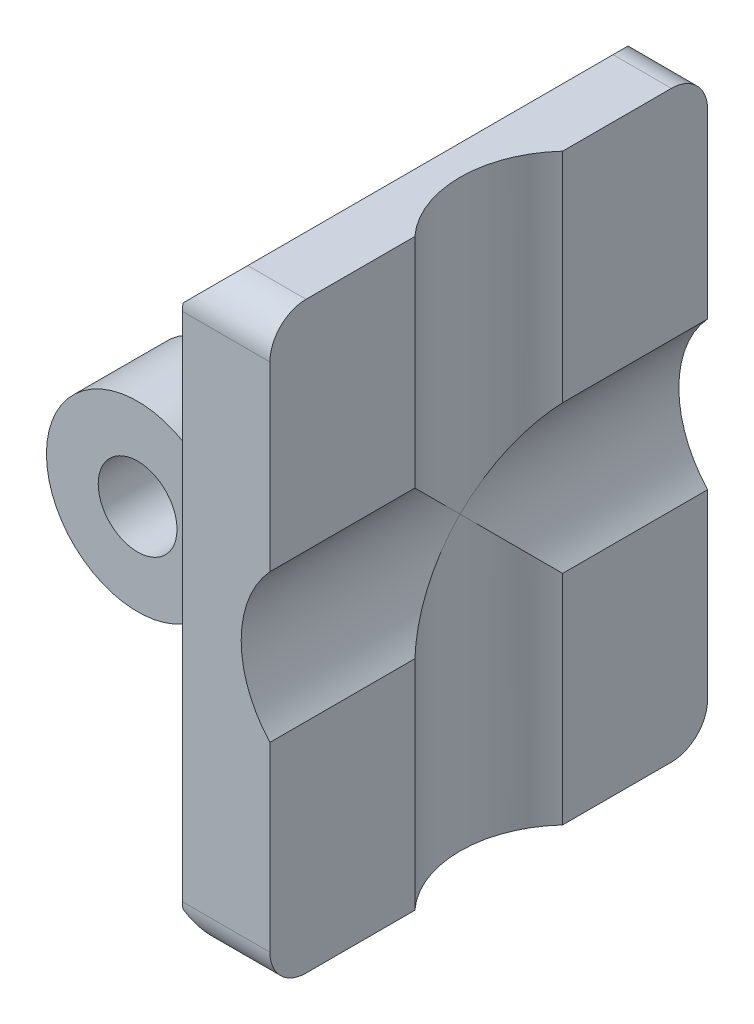
ISO-10303-21;
HEADER;
FILE_DESCRIPTION(('STEP AP214'),'2;1');
FILE_NAME('part.step','',(''),(''),'','','');
FILE_SCHEMA(('AUTOMOTIVE_DESIGN { 1 0 10303 214 1 1 1 1 }'));
ENDSEC;
DATA;
#1=APPLICATION_CONTEXT('core data for automotive mechanical design processes');
#2=APPLICATION_PROTOCOL_DEFINITION('international standard','automotive_design',2000,#1);
#3=PRODUCT_CONTEXT('',#1,'mechanical');
#4=PRODUCT('Part','Part','',(#3));
#5=PRODUCT_RELATED_PRODUCT_CATEGORY('part','',(#4));
#6=PRODUCT_DEFINITION_FORMATION('','',#4);
#7=PRODUCT_DEFINITION_CONTEXT('part definition',#1,'design');
#8=PRODUCT_DEFINITION('design','',#6,#7);
#9=PRODUCT_DEFINITION_SHAPE('','',#8);
#10=(LENGTH_UNIT() NAMED_UNIT(*) SI_UNIT(.MILLI.,.METRE.));
#11=(NAMED_UNIT(*) PLANE_ANGLE_UNIT() SI_UNIT($,.RADIAN.));
#12=(NAMED_UNIT(*) SI_UNIT($,.STERADIAN.) SOLID_ANGLE_UNIT());
#13=UNCERTAINTY_MEASURE_WITH_UNIT(LENGTH_MEASURE(1.E-05),#10,'distance_accuracy_value','');
#14=(GEOMETRIC_REPRESENTATION_CONTEXT(3) GLOBAL_UNCERTAINTY_ASSIGNED_CONTEXT((#13)) GLOBAL_UNIT_ASSIGNED_CONTEXT((#10,
#11,#12)) REPRESENTATION_CONTEXT('',''));
#15=CARTESIAN_POINT('',(0.,0.,0.));
#16=DIRECTION('',(0.,0.,1.));
#17=DIRECTION('',(1.,0.,0.));
#18=AXIS2_PLACEMENT_3D('',#15,#16,#17);
#19=CARTESIAN_POINT('',(0.,0.,-6.731));
#20=DIRECTION('',(0.,0.,1.));
#21=DIRECTION('',(1.,0.,0.));
#22=AXIS2_PLACEMENT_3D('',#19,#20,#21);
#23=CYLINDRICAL_SURFACE('',#22,3.96875);
#24=DIRECTION('',(0.,0.,1.));
#25=VECTOR('',#24,1.);
#26=CARTESIAN_POINT('',(2.38125,3.175,-6.731));
#27=LINE('',#26,#25);
#28=CARTESIAN_POINT('',(2.38125,3.175,-6.731));
#29=VERTEX_POINT('',#28);
#30=CARTESIAN_POINT('',(2.38125,3.175,6.731));
#31=VERTEX_POINT('',#30);
#32=EDGE_CURVE('E385',#29,#31,#27,.T.);
#33=ORIENTED_EDGE('',*,*,#32,.F.);
#34=CARTESIAN_POINT('',(0.,0.,-6.731));
#35=DIRECTION('',(0.,0.,-1.));
#36=DIRECTION('',(-1.,0.,0.));
#37=AXIS2_PLACEMENT_3D('',#34,#35,#36);
#38=CIRCLE('',#37,3.96875);
#39=CARTESIAN_POINT('',(2.38125,-3.175,-6.731));
#40=VERTEX_POINT('',#39);
#41=EDGE_CURVE('E254',#40,#29,#38,.T.);
#42=ORIENTED_EDGE('',*,*,#41,.F.);
#43=DIRECTION('',(0.,0.,1.));
#44=VECTOR('',#43,1.);
#45=CARTESIAN_POINT('',(2.38125,-3.175,-6.731));
#46=LINE('',#45,#44);
#47=CARTESIAN_POINT('',(2.38125,-3.175,6.731));
#48=VERTEX_POINT('',#47);
#49=EDGE_CURVE('E321',#40,#48,#46,.T.);
#50=ORIENTED_EDGE('',*,*,#49,.T.);
#51=CARTESIAN_POINT('',(0.,0.,6.731));
#52=DIRECTION('',(0.,0.,1.));
#53=DIRECTION('',(1.,0.,0.));
#54=AXIS2_PLACEMENT_3D('',#51,#52,#53);
#55=CIRCLE('',#54,3.96875);
#56=EDGE_CURVE('E263',#31,#48,#55,.T.);
#57=ORIENTED_EDGE('',*,*,#56,.F.);
#58=EDGE_LOOP('',(#33,#42,#50,#57));
#59=FACE_BOUND('',#58,.T.);
#60=DIRECTION('',(0.,0.,-1.));
#61=VECTOR('',#60,1.);
#62=CARTESIAN_POINT('',(-0.212777019498933,3.96304207679822,2.667));
#63=LINE('',#62,#61);
#64=CARTESIAN_POINT('',(-0.212777019498933,3.96304207679822,2.667));
#65=VERTEX_POINT('',#64);
#66=CARTESIAN_POINT('',(-0.212777019498933,3.96304207679822,1.27));
#67=VERTEX_POINT('',#66);
#68=EDGE_CURVE('E230',#65,#67,#63,.T.);
#69=ORIENTED_EDGE('',*,*,#68,.F.);
#70=CARTESIAN_POINT('',(0.,0.,2.667));
#71=DIRECTION('',(0.,0.,-1.));
#72=DIRECTION('',(-1.,0.,0.));
#73=AXIS2_PLACEMENT_3D('',#70,#71,#72);
#74=CIRCLE('',#73,3.96875);
#75=CARTESIAN_POINT('',(-3.96304207679822,0.212777019498943,2.667));
#76=VERTEX_POINT('',#75);
#77=EDGE_CURVE('E217',#76,#65,#74,.T.);
#78=ORIENTED_EDGE('',*,*,#77,.F.);
#79=DIRECTION('',(0.,0.,-1.));
#80=VECTOR('',#79,1.);
#81=CARTESIAN_POINT('',(-3.96304207679822,0.212777019498943,2.667));
#82=LINE('',#81,#80);
#83=CARTESIAN_POINT('',(-3.96304207679822,0.212777019498943,1.27));
#84=VERTEX_POINT('',#83);
#85=EDGE_CURVE('E232',#76,#84,#82,.T.);
#86=ORIENTED_EDGE('',*,*,#85,.T.);
#87=CARTESIAN_POINT('',(0.,0.,1.27));
#88=DIRECTION('',(0.,0.,-1.));
#89=DIRECTION('',(-1.,0.,0.));
#90=AXIS2_PLACEMENT_3D('',#87,#88,#89);
#91=CIRCLE('',#90,3.96875);
#92=EDGE_CURVE('E234',#84,#67,#91,.T.);
#93=ORIENTED_EDGE('',*,*,#92,.T.);
#94=EDGE_LOOP('',(#69,#78,#86,#93));
#95=FACE_BOUND('',#94,.T.);
#96=ADVANCED_FACE('F51',(#59,#95),#23,.T.);
#97=CARTESIAN_POINT('',(2.38125,-3.175,-6.731));
#98=DIRECTION('',(0.,-1.,0.));
#99=DIRECTION('',(0.,0.,-1.));
#100=AXIS2_PLACEMENT_3D('',#97,#98,#99);
#101=PLANE('',#100);
#102=DIRECTION('',(-1.,0.,0.));
#103=VECTOR('',#102,1.);
#104=CARTESIAN_POINT('',(4.74345,-3.175,-6.731));
#105=LINE('',#104,#103);
#106=CARTESIAN_POINT('',(3.47345,-3.175,-6.731));
#107=VERTEX_POINT('',#106);
#108=EDGE_CURVE('E261',#107,#40,#105,.T.);
#109=ORIENTED_EDGE('',*,*,#108,.F.);
#110=DIRECTION('',(0.,0.,-1.));
#111=VECTOR('',#110,1.);
#112=CARTESIAN_POINT('',(3.47345,-3.175,6.731));
#113=LINE('',#112,#111);
#114=CARTESIAN_POINT('',(3.47345,-3.175,6.731));
#115=VERTEX_POINT('',#114);
#116=EDGE_CURVE('E990',#107,#115,#113,.F.);
#117=ORIENTED_EDGE('',*,*,#116,.T.);
#118=DIRECTION('',(1.,0.,0.));
#119=VECTOR('',#118,1.);
#120=CARTESIAN_POINT('',(2.38125,-3.175,6.731));
#121=LINE('',#120,#119);
#122=EDGE_CURVE('E266',#48,#115,#121,.T.);
#123=ORIENTED_EDGE('',*,*,#122,.F.);
#124=ORIENTED_EDGE('',*,*,#49,.F.);
#125=EDGE_LOOP('',(#109,#117,#123,#124));
#126=FACE_BOUND('',#125,.T.);
#127=ADVANCED_FACE('F910',(#126),#101,.T.);
#128=CARTESIAN_POINT('',(2.38125,3.175,-6.731));
#129=DIRECTION('',(0.,1.,0.));
#130=DIRECTION('',(1.,0.,0.));
#131=AXIS2_PLACEMENT_3D('',#128,#129,#130);
#132=PLANE('',#131);
#133=DIRECTION('',(-1.,0.,0.));
#134=VECTOR('',#133,1.);
#135=CARTESIAN_POINT('',(4.74345,3.175,6.731));
#136=LINE('',#135,#134);
#137=CARTESIAN_POINT('',(3.47345,3.175,6.731));
#138=VERTEX_POINT('',#137);
#139=EDGE_CURVE('E271',#138,#31,#136,.T.);
#140=ORIENTED_EDGE('',*,*,#139,.F.);
#141=DIRECTION('',(0.,0.,-1.));
#142=VECTOR('',#141,1.);
#143=CARTESIAN_POINT('',(3.47345,3.175,-6.731));
#144=LINE('',#143,#142);
#145=CARTESIAN_POINT('',(3.47345,3.175,-6.731));
#146=VERTEX_POINT('',#145);
#147=EDGE_CURVE('E987',#138,#146,#144,.T.);
#148=ORIENTED_EDGE('',*,*,#147,.T.);
#149=DIRECTION('',(1.,0.,0.));
#150=VECTOR('',#149,1.);
#151=CARTESIAN_POINT('',(2.38125,3.175,-6.731));
#152=LINE('',#151,#150);
#153=EDGE_CURVE('E256',#29,#146,#152,.T.);
#154=ORIENTED_EDGE('',*,*,#153,.F.);
#155=ORIENTED_EDGE('',*,*,#32,.T.);
#156=EDGE_LOOP('',(#140,#148,#154,#155));
#157=FACE_BOUND('',#156,.T.);
#158=ADVANCED_FACE('F916',(#157),#132,.T.);
#159=CARTESIAN_POINT('',(12.065,-12.7,0.));
#160=DIRECTION('',(0.,1.,0.));
#161=DIRECTION('',(0.,0.,1.));
#162=AXIS2_PLACEMENT_3D('',#159,#160,#161);
#163=CYLINDRICAL_SURFACE('',#162,4.7625);
#164=CARTESIAN_POINT('',(7.3025,0.,0.));
#165=CARTESIAN_POINT('',(7.30249999999999,-1.20523715720365,1.20523715720366));
#166=CARTESIAN_POINT('',(7.7392772362853,-2.32854577506756,2.32854577506756));
#167=CARTESIAN_POINT('',(8.55345,-3.21720730564572,3.21720730564572));
#168=(BOUNDED_CURVE() B_SPLINE_CURVE(3,(#164,#165,#166,#167),.UNSPECIFIED.,.F.,
.F.) B_SPLINE_CURVE_WITH_KNOTS((4,4),(1.5707963267949,2.31247836980469),
.UNSPECIFIED.) CURVE() GEOMETRIC_REPRESENTATION_ITEM() RATIONAL_B_SPLINE_CURVE((1.,
0.954681926374368,0.954681926374368,1.)) REPRESENTATION_ITEM(''));
#169=CARTESIAN_POINT('',(7.3025,0.,0.));
#170=VERTEX_POINT('',#169);
#171=CARTESIAN_POINT('',(8.55345,-3.21720730564572,3.21720730564573));
#172=VERTEX_POINT('',#171);
#173=EDGE_CURVE('E384',#170,#172,#168,.T.);
#174=ORIENTED_EDGE('',*,*,#173,.T.);
#175=DIRECTION('',(0.,1.,0.));
#176=VECTOR('',#175,1.);
#177=CARTESIAN_POINT('',(8.55345,-12.7,3.21720730564573));
#178=LINE('',#177,#176);
#179=CARTESIAN_POINT('',(8.55345,-12.7,3.21720730564573));
#180=VERTEX_POINT('',#179);
#181=EDGE_CURVE('E310',#180,#172,#178,.T.);
#182=ORIENTED_EDGE('',*,*,#181,.F.);
#183=CARTESIAN_POINT('',(12.065,-12.7,0.));
#184=DIRECTION('',(0.,1.,0.));
#185=DIRECTION('',(0.,0.,-1.));
#186=AXIS2_PLACEMENT_3D('',#183,#184,#185);
#187=CIRCLE('',#186,4.76250000000002);
#188=CARTESIAN_POINT('',(8.55345,-12.7,-3.21720730564573));
#189=VERTEX_POINT('',#188);
#190=EDGE_CURVE('E304',#189,#180,#187,.T.);
#191=ORIENTED_EDGE('',*,*,#190,.F.);
#192=DIRECTION('',(0.,1.,0.));
#193=VECTOR('',#192,1.);
#194=CARTESIAN_POINT('',(8.55345,-12.7,-3.21720730564573));
#195=LINE('',#194,#193);
#196=CARTESIAN_POINT('',(8.55345,-3.21720730564569,-3.21720730564573));
#197=VERTEX_POINT('',#196);
#198=EDGE_CURVE('E307',#189,#197,#195,.T.);
#199=ORIENTED_EDGE('',*,*,#198,.T.);
#200=CARTESIAN_POINT('',(8.55345,-3.21720730564572,-3.21720730564572));
#201=CARTESIAN_POINT('',(7.7392772362853,-2.32854577506756,-2.32854577506756));
#202=CARTESIAN_POINT('',(7.30249999999999,-1.20523715720366,-1.20523715720365));
#203=CARTESIAN_POINT('',(7.3025,0.,0.));
#204=(BOUNDED_CURVE() B_SPLINE_CURVE(3,(#200,#201,#202,#203),.UNSPECIFIED.,.F.,
.F.) B_SPLINE_CURVE_WITH_KNOTS((4,4),(3.9707069373749,4.71238898038469),
.UNSPECIFIED.) CURVE() GEOMETRIC_REPRESENTATION_ITEM() RATIONAL_B_SPLINE_CURVE((1.,
0.954681926374368,0.954681926374368,1.)) REPRESENTATION_ITEM(''));
#205=EDGE_CURVE('E376',#197,#170,#204,.T.);
#206=ORIENTED_EDGE('',*,*,#205,.T.);
#207=EDGE_LOOP('',(#174,#182,#191,#199,#206));
#208=FACE_BOUND('',#207,.T.);
#209=ADVANCED_FACE('F827',(#208),#163,.F.);
#210=CARTESIAN_POINT('',(4.74345,12.7,-9.525));
#211=DIRECTION('',(-1.,0.,0.));
#212=DIRECTION('',(0.,1.,0.));
#213=AXIS2_PLACEMENT_3D('',#210,#211,#212);
#214=PLANE('',#213);
#215=DIRECTION('',(0.,0.,1.));
#216=VECTOR('',#215,1.);
#217=CARTESIAN_POINT('',(4.74345,-11.43,-9.525));
#218=LINE('',#217,#216);
#219=CARTESIAN_POINT('',(4.74345,-11.43,-9.49522168269575));
#220=VERTEX_POINT('',#219);
#221=CARTESIAN_POINT('',(4.74345,-11.43,9.49522168269575));
#222=VERTEX_POINT('',#221);
#223=EDGE_CURVE('E897',#220,#222,#218,.T.);
#224=ORIENTED_EDGE('',*,*,#223,.T.);
#225=CARTESIAN_POINT('',(4.74345,-11.1252,7.9502));
#226=DIRECTION('',(-1.,0.,0.));
#227=DIRECTION('',(0.,-1.,0.));
#228=AXIS2_PLACEMENT_3D('',#225,#226,#227);
#229=CIRCLE('',#228,1.5748);
#230=CARTESIAN_POINT('',(4.74344999999765,-11.1252,9.525));
#231=VERTEX_POINT('',#230);
#232=EDGE_CURVE('E876',#222,#231,#229,.T.);
#233=ORIENTED_EDGE('',*,*,#232,.T.);
#234=DIRECTION('',(-1.64400304585891E-13,-1.,0.));
#235=VECTOR('',#234,1.);
#236=CARTESIAN_POINT('',(4.74345,3.175,9.525));
#237=LINE('',#236,#235);
#238=CARTESIAN_POINT('',(4.74345000000131,11.1252,9.525));
#239=VERTEX_POINT('',#238);
#240=EDGE_CURVE('E292',#239,#231,#237,.T.);
#241=ORIENTED_EDGE('',*,*,#240,.F.);
#242=CARTESIAN_POINT('',(4.74345,11.1252,7.9502));
#243=DIRECTION('',(-1.,0.,0.));
#244=DIRECTION('',(0.,-1.,0.));
#245=AXIS2_PLACEMENT_3D('',#242,#243,#244);
#246=CIRCLE('',#245,1.5748);
#247=CARTESIAN_POINT('',(4.74345,11.43,9.49522168269575));
#248=VERTEX_POINT('',#247);
#249=EDGE_CURVE('E899',#239,#248,#246,.T.);
#250=ORIENTED_EDGE('',*,*,#249,.T.);
#251=DIRECTION('',(0.,0.,-1.));
#252=VECTOR('',#251,1.);
#253=CARTESIAN_POINT('',(4.74345,11.43,-9.525));
#254=LINE('',#253,#252);
#255=CARTESIAN_POINT('',(4.74345,11.43,-9.49522168269575));
#256=VERTEX_POINT('',#255);
#257=EDGE_CURVE('E895',#248,#256,#254,.T.);
#258=ORIENTED_EDGE('',*,*,#257,.T.);
#259=CARTESIAN_POINT('',(4.74345,11.1252,-7.9502));
#260=DIRECTION('',(-1.,0.,0.));
#261=DIRECTION('',(0.,-1.,0.));
#262=AXIS2_PLACEMENT_3D('',#259,#260,#261);
#263=CIRCLE('',#262,1.5748);
#264=CARTESIAN_POINT('',(4.74345,11.1252,-9.525));
#265=VERTEX_POINT('',#264);
#266=EDGE_CURVE('E961',#256,#265,#263,.T.);
#267=ORIENTED_EDGE('',*,*,#266,.T.);
#268=DIRECTION('',(0.,1.,0.));
#269=VECTOR('',#268,1.);
#270=CARTESIAN_POINT('',(4.74345,-3.175,-9.525));
#271=LINE('',#270,#269);
#272=CARTESIAN_POINT('',(4.74345,-11.1252,-9.525));
#273=VERTEX_POINT('',#272);
#274=EDGE_CURVE('E279',#273,#265,#271,.T.);
#275=ORIENTED_EDGE('',*,*,#274,.F.);
#276=CARTESIAN_POINT('',(4.74345,-11.1252,-7.9502));
#277=DIRECTION('',(-1.,0.,0.));
#278=DIRECTION('',(0.,-1.,0.));
#279=AXIS2_PLACEMENT_3D('',#276,#277,#278);
#280=CIRCLE('',#279,1.5748);
#281=EDGE_CURVE('E879',#273,#220,#280,.T.);
#282=ORIENTED_EDGE('',*,*,#281,.T.);
#283=EDGE_LOOP('',(#224,#233,#241,#250,#258,#267,#275,#282));
#284=FACE_BOUND('',#283,.T.);
#285=DIRECTION('',(0.,0.,-1.));
#286=VECTOR('',#285,1.);
#287=CARTESIAN_POINT('',(4.74345,-4.445,-6.731));
#288=LINE('',#287,#286);
#289=CARTESIAN_POINT('',(4.74345,-4.445,6.731));
#290=VERTEX_POINT('',#289);
#291=CARTESIAN_POINT('',(4.74345,-4.445,-6.731));
#292=VERTEX_POINT('',#291);
#293=EDGE_CURVE('E992',#290,#292,#288,.T.);
#294=ORIENTED_EDGE('',*,*,#293,.T.);
#295=DIRECTION('',(0.,-1.,0.));
#296=VECTOR('',#295,1.);
#297=CARTESIAN_POINT('',(4.74345,3.175,-6.731));
#298=LINE('',#297,#296);
#299=CARTESIAN_POINT('',(4.74345,4.445,-6.731));
#300=VERTEX_POINT('',#299);
#301=EDGE_CURVE('E259',#300,#292,#298,.T.);
#302=ORIENTED_EDGE('',*,*,#301,.F.);
#303=DIRECTION('',(0.,0.,-1.));
#304=VECTOR('',#303,1.);
#305=CARTESIAN_POINT('',(4.74345,4.445,6.731));
#306=LINE('',#305,#304);
#307=CARTESIAN_POINT('',(4.74345,4.445,6.731));
#308=VERTEX_POINT('',#307);
#309=EDGE_CURVE('E995',#300,#308,#306,.F.);
#310=ORIENTED_EDGE('',*,*,#309,.T.);
#311=DIRECTION('',(0.,1.,0.));
#312=VECTOR('',#311,1.);
#313=CARTESIAN_POINT('',(4.74345,-3.175,6.731));
#314=LINE('',#313,#312);
#315=EDGE_CURVE('E269',#290,#308,#314,.T.);
#316=ORIENTED_EDGE('',*,*,#315,.F.);
#317=EDGE_LOOP('',(#294,#302,#310,#316));
#318=FACE_BOUND('',#317,.T.);
#319=ADVANCED_FACE('F923',(#284,#318),#214,.T.);
#320=CARTESIAN_POINT('',(12.065,0.,9.525));
#321=DIRECTION('',(0.,0.,-1.));
#322=DIRECTION('',(-1.,0.,0.));
#323=AXIS2_PLACEMENT_3D('',#320,#321,#322);
#324=CYLINDRICAL_SURFACE('',#323,4.7625);
#325=CARTESIAN_POINT('',(8.55345,3.21720730564572,3.21720730564572));
#326=CARTESIAN_POINT('',(7.7392772362853,2.32854577506756,2.32854577506756));
#327=CARTESIAN_POINT('',(7.30249999999999,1.20523715720366,1.20523715720366));
#328=CARTESIAN_POINT('',(7.3025,0.,0.));
#329=(BOUNDED_CURVE() B_SPLINE_CURVE(3,(#325,#326,#327,#328),.UNSPECIFIED.,.F.,
.F.) B_SPLINE_CURVE_WITH_KNOTS((4,4),(0.829114283785109,1.5707963267949),
.UNSPECIFIED.) CURVE() GEOMETRIC_REPRESENTATION_ITEM() RATIONAL_B_SPLINE_CURVE((1.,
0.954681926374368,0.954681926374368,1.)) REPRESENTATION_ITEM(''));
#330=CARTESIAN_POINT('',(8.55345000000001,3.21720730564573,3.21720730564573));
#331=VERTEX_POINT('',#330);
#332=EDGE_CURVE('E313',#331,#170,#329,.T.);
#333=ORIENTED_EDGE('',*,*,#332,.F.);
#334=DIRECTION('',(0.,0.,-1.));
#335=VECTOR('',#334,1.);
#336=CARTESIAN_POINT('',(8.55345,3.21720730564569,9.525));
#337=LINE('',#336,#335);
#338=CARTESIAN_POINT('',(8.55345000000001,3.21720730564573,9.525));
#339=VERTEX_POINT('',#338);
#340=EDGE_CURVE('E302',#339,#331,#337,.T.);
#341=ORIENTED_EDGE('',*,*,#340,.F.);
#342=CARTESIAN_POINT('',(12.065,0.,9.525));
#343=DIRECTION('',(0.,0.,-1.));
#344=DIRECTION('',(1.,0.,0.));
#345=AXIS2_PLACEMENT_3D('',#342,#343,#344);
#346=CIRCLE('',#345,4.7625);
#347=CARTESIAN_POINT('',(8.55345,-3.21720730564569,9.525));
#348=VERTEX_POINT('',#347);
#349=EDGE_CURVE('E289',#348,#339,#346,.T.);
#350=ORIENTED_EDGE('',*,*,#349,.F.);
#351=DIRECTION('',(0.,0.,-1.));
#352=VECTOR('',#351,1.);
#353=CARTESIAN_POINT('',(8.55345,-3.21720730564569,9.525));
#354=LINE('',#353,#352);
#355=EDGE_CURVE('E297',#348,#172,#354,.T.);
#356=ORIENTED_EDGE('',*,*,#355,.T.);
#357=ORIENTED_EDGE('',*,*,#173,.F.);
#358=EDGE_LOOP('',(#333,#341,#350,#356,#357));
#359=FACE_BOUND('',#358,.T.);
#360=ADVANCED_FACE('F821',(#359),#324,.F.);
#361=CARTESIAN_POINT('',(12.065,-12.7,0.));
#362=DIRECTION('',(0.,1.,0.));
#363=DIRECTION('',(0.,0.,1.));
#364=AXIS2_PLACEMENT_3D('',#361,#362,#363);
#365=CYLINDRICAL_SURFACE('',#364,4.7625);
#366=CARTESIAN_POINT('',(7.3025,0.,0.));
#367=CARTESIAN_POINT('',(7.30249999999999,1.20523715720366,-1.20523715720365));
#368=CARTESIAN_POINT('',(7.7392772362853,2.32854577506756,-2.32854577506756));
#369=CARTESIAN_POINT('',(8.55345,3.21720730564573,-3.21720730564572));
#370=(BOUNDED_CURVE() B_SPLINE_CURVE(3,(#366,#367,#368,#369),.UNSPECIFIED.,.F.,
.F.) B_SPLINE_CURVE_WITH_KNOTS((4,4),(4.71238898038469,5.45407102339448),
.UNSPECIFIED.) CURVE() GEOMETRIC_REPRESENTATION_ITEM() RATIONAL_B_SPLINE_CURVE((1.,
0.954681926374368,0.954681926374368,1.)) REPRESENTATION_ITEM(''));
#371=CARTESIAN_POINT('',(8.55345000000001,3.21720730564573,-3.21720730564572));
#372=VERTEX_POINT('',#371);
#373=EDGE_CURVE('E314',#170,#372,#370,.T.);
#374=ORIENTED_EDGE('',*,*,#373,.T.);
#375=DIRECTION('',(0.,-1.,0.));
#376=VECTOR('',#375,1.);
#377=CARTESIAN_POINT('',(8.55345,12.7,-3.21720730564572));
#378=LINE('',#377,#376);
#379=CARTESIAN_POINT('',(8.55345,12.7,-3.21720730564572));
#380=VERTEX_POINT('',#379);
#381=EDGE_CURVE('E247',#380,#372,#378,.T.);
#382=ORIENTED_EDGE('',*,*,#381,.F.);
#383=CARTESIAN_POINT('',(12.065,12.7,0.));
#384=DIRECTION('',(0.,-1.,0.));
#385=DIRECTION('',(-1.,0.,0.));
#386=AXIS2_PLACEMENT_3D('',#383,#384,#385);
#387=CIRCLE('',#386,4.76250000000002);
#388=CARTESIAN_POINT('',(8.55345,12.7,3.21720730564573));
#389=VERTEX_POINT('',#388);
#390=EDGE_CURVE('E241',#389,#380,#387,.T.);
#391=ORIENTED_EDGE('',*,*,#390,.F.);
#392=DIRECTION('',(0.,-1.,0.));
#393=VECTOR('',#392,1.);
#394=CARTESIAN_POINT('',(8.55345,12.7,3.21720730564573));
#395=LINE('',#394,#393);
#396=EDGE_CURVE('E249',#389,#331,#395,.T.);
#397=ORIENTED_EDGE('',*,*,#396,.T.);
#398=ORIENTED_EDGE('',*,*,#332,.T.);
#399=EDGE_LOOP('',(#374,#382,#391,#397,#398));
#400=FACE_BOUND('',#399,.T.);
#401=ADVANCED_FACE('F814',(#400),#365,.F.);
#402=CARTESIAN_POINT('',(12.065,0.,9.525));
#403=DIRECTION('',(0.,0.,-1.));
#404=DIRECTION('',(-1.,0.,0.));
#405=AXIS2_PLACEMENT_3D('',#402,#403,#404);
#406=CYLINDRICAL_SURFACE('',#405,4.7625);
#407=ORIENTED_EDGE('',*,*,#205,.F.);
#408=DIRECTION('',(0.,0.,1.));
#409=VECTOR('',#408,1.);
#410=CARTESIAN_POINT('',(8.55345,-3.21720730564569,-9.525));
#411=LINE('',#410,#409);
#412=CARTESIAN_POINT('',(8.55345,-3.21720730564569,-9.525));
#413=VERTEX_POINT('',#412);
#414=EDGE_CURVE('E287',#413,#197,#411,.T.);
#415=ORIENTED_EDGE('',*,*,#414,.F.);
#416=CARTESIAN_POINT('',(12.065,0.,-9.525));
#417=DIRECTION('',(0.,0.,1.));
#418=DIRECTION('',(-1.,0.,0.));
#419=AXIS2_PLACEMENT_3D('',#416,#417,#418);
#420=CIRCLE('',#419,4.76250000000001);
#421=CARTESIAN_POINT('',(8.55345000000001,3.21720730564573,-9.525));
#422=VERTEX_POINT('',#421);
#423=EDGE_CURVE('E273',#422,#413,#420,.T.);
#424=ORIENTED_EDGE('',*,*,#423,.F.);
#425=DIRECTION('',(0.,0.,1.));
#426=VECTOR('',#425,1.);
#427=CARTESIAN_POINT('',(8.55345000000001,3.21720730564573,-9.525));
#428=LINE('',#427,#426);
#429=EDGE_CURVE('E282',#422,#372,#428,.T.);
#430=ORIENTED_EDGE('',*,*,#429,.T.);
#431=ORIENTED_EDGE('',*,*,#373,.F.);
#432=EDGE_LOOP('',(#407,#415,#424,#430,#431));
#433=FACE_BOUND('',#432,.T.);
#434=ADVANCED_FACE('F832',(#433),#406,.F.);
#435=CARTESIAN_POINT('',(12.065,-12.7,0.));
#436=DIRECTION('',(0.,-1.,0.));
#437=DIRECTION('',(0.,0.,-1.));
#438=AXIS2_PLACEMENT_3D('',#435,#436,#437);
#439=PLANE('',#438);
#440=DIRECTION('',(0.,0.,-1.));
#441=VECTOR('',#440,1.);
#442=CARTESIAN_POINT('',(8.55345,-12.7,9.525));
#443=LINE('',#442,#441);
#444=CARTESIAN_POINT('',(8.55345,-12.7,7.9502));
#445=VERTEX_POINT('',#444);
#446=EDGE_CURVE('E300',#445,#180,#443,.T.);
#447=ORIENTED_EDGE('',*,*,#446,.F.);
#448=DIRECTION('',(1.,0.,0.));
#449=VECTOR('',#448,1.);
#450=CARTESIAN_POINT('',(12.065,-12.7,7.9502));
#451=LINE('',#450,#449);
#452=CARTESIAN_POINT('',(6.01345,-12.7,7.9502));
#453=VERTEX_POINT('',#452);
#454=EDGE_CURVE('E957',#445,#453,#451,.F.);
#455=ORIENTED_EDGE('',*,*,#454,.T.);
#456=DIRECTION('',(0.,0.,-1.));
#457=VECTOR('',#456,1.);
#458=CARTESIAN_POINT('',(6.01345,-12.7,0.));
#459=LINE('',#458,#457);
#460=CARTESIAN_POINT('',(6.01345,-12.7,-7.9502));
#461=VERTEX_POINT('',#460);
#462=EDGE_CURVE('E998',#453,#461,#459,.T.);
#463=ORIENTED_EDGE('',*,*,#462,.T.);
#464=DIRECTION('',(-1.,0.,0.));
#465=VECTOR('',#464,1.);
#466=CARTESIAN_POINT('',(12.065,-12.7,-7.9502));
#467=LINE('',#466,#465);
#468=CARTESIAN_POINT('',(8.55345,-12.7,-7.9502));
#469=VERTEX_POINT('',#468);
#470=EDGE_CURVE('E861',#461,#469,#467,.F.);
#471=ORIENTED_EDGE('',*,*,#470,.T.);
#472=DIRECTION('',(0.,0.,1.));
#473=VECTOR('',#472,1.);
#474=CARTESIAN_POINT('',(8.55345,-12.7,-9.525));
#475=LINE('',#474,#473);
#476=EDGE_CURVE('E285',#469,#189,#475,.T.);
#477=ORIENTED_EDGE('',*,*,#476,.T.);
#478=ORIENTED_EDGE('',*,*,#190,.T.);
#479=EDGE_LOOP('',(#447,#455,#463,#471,#477,#478));
#480=FACE_BOUND('',#479,.T.);
#481=ADVANCED_FACE('F856',(#480),#439,.T.);
#482=CARTESIAN_POINT('',(8.55345,-3.21720730564569,9.525));
#483=DIRECTION('',(-1.,0.,0.));
#484=DIRECTION('',(0.,-1.,0.));
#485=AXIS2_PLACEMENT_3D('',#482,#483,#484);
#486=PLANE('',#485);
#487=DIRECTION('',(0.,1.,0.));
#488=VECTOR('',#487,1.);
#489=CARTESIAN_POINT('',(8.55345,-3.21720730564569,9.525));
#490=LINE('',#489,#488);
#491=CARTESIAN_POINT('',(8.55345,-11.1252,9.525));
#492=VERTEX_POINT('',#491);
#493=EDGE_CURVE('E295',#492,#348,#490,.T.);
#494=ORIENTED_EDGE('',*,*,#493,.F.);
#495=CARTESIAN_POINT('',(8.55345,-11.1252,7.9502));
#496=DIRECTION('',(-1.,0.,0.));
#497=DIRECTION('',(0.,-1.,0.));
#498=AXIS2_PLACEMENT_3D('',#495,#496,#497);
#499=CIRCLE('',#498,1.5748);
#500=EDGE_CURVE('E970',#492,#445,#499,.F.);
#501=ORIENTED_EDGE('',*,*,#500,.T.);
#502=ORIENTED_EDGE('',*,*,#446,.T.);
#503=ORIENTED_EDGE('',*,*,#181,.T.);
#504=ORIENTED_EDGE('',*,*,#355,.F.);
#505=EDGE_LOOP('',(#494,#501,#502,#503,#504));
#506=FACE_BOUND('',#505,.T.);
#507=ADVANCED_FACE('F853',(#506),#486,.F.);
#508=CARTESIAN_POINT('',(12.065,0.,9.525));
#509=DIRECTION('',(0.,0.,1.));
#510=DIRECTION('',(1.,0.,0.));
#511=AXIS2_PLACEMENT_3D('',#508,#509,#510);
#512=PLANE('',#511);
#513=ORIENTED_EDGE('',*,*,#240,.T.);
#514=DIRECTION('',(1.,0.,0.));
#515=VECTOR('',#514,1.);
#516=CARTESIAN_POINT('',(12.065,-11.1252,9.525));
#517=LINE('',#516,#515);
#518=EDGE_CURVE('E851',#231,#492,#517,.T.);
#519=ORIENTED_EDGE('',*,*,#518,.T.);
#520=ORIENTED_EDGE('',*,*,#493,.T.);
#521=ORIENTED_EDGE('',*,*,#349,.T.);
#522=DIRECTION('',(0.,-1.,0.));
#523=VECTOR('',#522,1.);
#524=CARTESIAN_POINT('',(8.55345,12.7,9.525));
#525=LINE('',#524,#523);
#526=CARTESIAN_POINT('',(8.55345,11.1252,9.525));
#527=VERTEX_POINT('',#526);
#528=EDGE_CURVE('E252',#527,#339,#525,.T.);
#529=ORIENTED_EDGE('',*,*,#528,.F.);
#530=DIRECTION('',(1.,0.,0.));
#531=VECTOR('',#530,1.);
#532=CARTESIAN_POINT('',(12.065,11.1252,9.525));
#533=LINE('',#532,#531);
#534=EDGE_CURVE('E975',#527,#239,#533,.F.);
#535=ORIENTED_EDGE('',*,*,#534,.T.);
#536=EDGE_LOOP('',(#513,#519,#520,#521,#529,#535));
#537=FACE_BOUND('',#536,.T.);
#538=ADVANCED_FACE('F847',(#537),#512,.T.);
#539=CARTESIAN_POINT('',(8.55345,-12.7,-9.525));
#540=DIRECTION('',(-1.,0.,0.));
#541=DIRECTION('',(0.,-1.,0.));
#542=AXIS2_PLACEMENT_3D('',#539,#540,#541);
#543=PLANE('',#542);
#544=ORIENTED_EDGE('',*,*,#476,.F.);
#545=CARTESIAN_POINT('',(8.55345,-11.1252,-7.9502));
#546=DIRECTION('',(-1.,0.,0.));
#547=DIRECTION('',(0.,-1.,0.));
#548=AXIS2_PLACEMENT_3D('',#545,#546,#547);
#549=CIRCLE('',#548,1.5748);
#550=CARTESIAN_POINT('',(8.55345,-11.1252,-9.525));
#551=VERTEX_POINT('',#550);
#552=EDGE_CURVE('E865',#469,#551,#549,.F.);
#553=ORIENTED_EDGE('',*,*,#552,.T.);
#554=DIRECTION('',(0.,-1.,0.));
#555=VECTOR('',#554,1.);
#556=CARTESIAN_POINT('',(8.55345,-12.7,-9.525));
#557=LINE('',#556,#555);
#558=EDGE_CURVE('E276',#413,#551,#557,.T.);
#559=ORIENTED_EDGE('',*,*,#558,.F.);
#560=ORIENTED_EDGE('',*,*,#414,.T.);
#561=ORIENTED_EDGE('',*,*,#198,.F.);
#562=EDGE_LOOP('',(#544,#553,#559,#560,#561));
#563=FACE_BOUND('',#562,.T.);
#564=ADVANCED_FACE('F864',(#563),#543,.F.);
#565=CARTESIAN_POINT('',(12.065,0.,-9.525));
#566=DIRECTION('',(0.,0.,-1.));
#567=DIRECTION('',(-1.,0.,0.));
#568=AXIS2_PLACEMENT_3D('',#565,#566,#567);
#569=PLANE('',#568);
#570=ORIENTED_EDGE('',*,*,#558,.T.);
#571=DIRECTION('',(-1.,0.,0.));
#572=VECTOR('',#571,1.);
#573=CARTESIAN_POINT('',(12.065,-11.1252,-9.525));
#574=LINE('',#573,#572);
#575=EDGE_CURVE('E875',#551,#273,#574,.T.);
#576=ORIENTED_EDGE('',*,*,#575,.T.);
#577=ORIENTED_EDGE('',*,*,#274,.T.);
#578=DIRECTION('',(-1.,0.,0.));
#579=VECTOR('',#578,1.);
#580=CARTESIAN_POINT('',(12.065,11.1252,-9.525));
#581=LINE('',#580,#579);
#582=CARTESIAN_POINT('',(8.55345,11.1252,-9.525));
#583=VERTEX_POINT('',#582);
#584=EDGE_CURVE('E871',#265,#583,#581,.F.);
#585=ORIENTED_EDGE('',*,*,#584,.T.);
#586=DIRECTION('',(0.,-1.,0.));
#587=VECTOR('',#586,1.);
#588=CARTESIAN_POINT('',(8.55345,12.7,-9.525));
#589=LINE('',#588,#587);
#590=EDGE_CURVE('E245',#583,#422,#589,.T.);
#591=ORIENTED_EDGE('',*,*,#590,.T.);
#592=ORIENTED_EDGE('',*,*,#423,.T.);
#593=EDGE_LOOP('',(#570,#576,#577,#585,#591,#592));
#594=FACE_BOUND('',#593,.T.);
#595=ADVANCED_FACE('F869',(#594),#569,.T.);
#596=CARTESIAN_POINT('',(0.,0.,6.731));
#597=DIRECTION('',(0.,0.,1.));
#598=DIRECTION('',(1.,0.,0.));
#599=AXIS2_PLACEMENT_3D('',#596,#597,#598);
#600=PLANE('',#599);
#601=CARTESIAN_POINT('',(0.,0.,6.731));
#602=DIRECTION('',(0.,0.,1.));
#603=DIRECTION('',(1.,0.,0.));
#604=AXIS2_PLACEMENT_3D('',#601,#602,#603);
#605=CIRCLE('',#604,1.71449999999999);
#606=CARTESIAN_POINT('',(1.71449999999999,0.,6.731));
#607=VERTEX_POINT('',#606);
#608=EDGE_CURVE('E1403',#607,#607,#605,.T.);
#609=ORIENTED_EDGE('',*,*,#608,.F.);
#610=EDGE_LOOP('',(#609));
#611=FACE_BOUND('',#610,.T.);
#612=ORIENTED_EDGE('',*,*,#56,.T.);
#613=ORIENTED_EDGE('',*,*,#122,.T.);
#614=CARTESIAN_POINT('',(3.47345,-4.445,6.731));
#615=DIRECTION('',(0.,0.,1.));
#616=DIRECTION('',(1.,0.,0.));
#617=AXIS2_PLACEMENT_3D('',#614,#615,#616);
#618=CIRCLE('',#617,1.27);
#619=EDGE_CURVE('E982',#115,#290,#618,.F.);
#620=ORIENTED_EDGE('',*,*,#619,.T.);
#621=ORIENTED_EDGE('',*,*,#315,.T.);
#622=CARTESIAN_POINT('',(3.47345,4.445,6.731));
#623=DIRECTION('',(0.,0.,1.));
#624=DIRECTION('',(1.,0.,0.));
#625=AXIS2_PLACEMENT_3D('',#622,#623,#624);
#626=CIRCLE('',#625,1.27);
#627=EDGE_CURVE('E977',#308,#138,#626,.F.);
#628=ORIENTED_EDGE('',*,*,#627,.T.);
#629=ORIENTED_EDGE('',*,*,#139,.T.);
#630=EDGE_LOOP('',(#612,#613,#620,#621,#628,#629));
#631=FACE_BOUND('',#630,.T.);
#632=ADVANCED_FACE('F1006',(#611,#631),#600,.T.);
#633=CARTESIAN_POINT('',(0.,0.,-6.731));
#634=DIRECTION('',(0.,0.,-1.));
#635=DIRECTION('',(-1.,0.,0.));
#636=AXIS2_PLACEMENT_3D('',#633,#634,#635);
#637=PLANE('',#636);
#638=CARTESIAN_POINT('',(0.,0.,-6.731));
#639=DIRECTION('',(0.,0.,-1.));
#640=DIRECTION('',(-1.,0.,0.));
#641=AXIS2_PLACEMENT_3D('',#638,#639,#640);
#642=CIRCLE('',#641,1.71449999999999);
#643=CARTESIAN_POINT('',(-1.71449999999999,0.,-6.731));
#644=VERTEX_POINT('',#643);
#645=EDGE_CURVE('E1405',#644,#644,#642,.T.);
#646=ORIENTED_EDGE('',*,*,#645,.F.);
#647=EDGE_LOOP('',(#646));
#648=FACE_BOUND('',#647,.T.);
#649=ORIENTED_EDGE('',*,*,#41,.T.);
#650=ORIENTED_EDGE('',*,*,#153,.T.);
#651=CARTESIAN_POINT('',(3.47345,4.445,-6.731));
#652=DIRECTION('',(0.,0.,-1.));
#653=DIRECTION('',(-1.,0.,0.));
#654=AXIS2_PLACEMENT_3D('',#651,#652,#653);
#655=CIRCLE('',#654,1.27);
#656=EDGE_CURVE('E979',#146,#300,#655,.F.);
#657=ORIENTED_EDGE('',*,*,#656,.T.);
#658=ORIENTED_EDGE('',*,*,#301,.T.);
#659=CARTESIAN_POINT('',(3.47345,-4.445,-6.731));
#660=DIRECTION('',(0.,0.,-1.));
#661=DIRECTION('',(-1.,0.,0.));
#662=AXIS2_PLACEMENT_3D('',#659,#660,#661);
#663=CIRCLE('',#662,1.27);
#664=EDGE_CURVE('E985',#292,#107,#663,.F.);
#665=ORIENTED_EDGE('',*,*,#664,.T.);
#666=ORIENTED_EDGE('',*,*,#108,.T.);
#667=EDGE_LOOP('',(#649,#650,#657,#658,#665,#666));
#668=FACE_BOUND('',#667,.T.);
#669=ADVANCED_FACE('F1021',(#648,#668),#637,.T.);
#670=CARTESIAN_POINT('',(8.55345,12.7,3.21720730564572));
#671=DIRECTION('',(-1.,0.,0.));
#672=DIRECTION('',(0.,-1.,0.));
#673=AXIS2_PLACEMENT_3D('',#670,#671,#672);
#674=PLANE('',#673);
#675=DIRECTION('',(0.,0.,-1.));
#676=VECTOR('',#675,1.);
#677=CARTESIAN_POINT('',(8.55345,12.7,3.21720730564572));
#678=LINE('',#677,#676);
#679=CARTESIAN_POINT('',(8.55345,12.7,7.9502));
#680=VERTEX_POINT('',#679);
#681=EDGE_CURVE('E236',#680,#389,#678,.T.);
#682=ORIENTED_EDGE('',*,*,#681,.F.);
#683=CARTESIAN_POINT('',(8.55345,11.1252,7.9502));
#684=DIRECTION('',(-1.,0.,0.));
#685=DIRECTION('',(0.,-1.,0.));
#686=AXIS2_PLACEMENT_3D('',#683,#684,#685);
#687=CIRCLE('',#686,1.5748);
#688=EDGE_CURVE('E72',#680,#527,#687,.F.);
#689=ORIENTED_EDGE('',*,*,#688,.T.);
#690=ORIENTED_EDGE('',*,*,#528,.T.);
#691=ORIENTED_EDGE('',*,*,#340,.T.);
#692=ORIENTED_EDGE('',*,*,#396,.F.);
#693=EDGE_LOOP('',(#682,#689,#690,#691,#692));
#694=FACE_BOUND('',#693,.T.);
#695=ADVANCED_FACE('F844',(#694),#674,.F.);
#696=CARTESIAN_POINT('',(8.55345,12.7,-9.525));
#697=DIRECTION('',(-1.,0.,0.));
#698=DIRECTION('',(0.,-1.,0.));
#699=AXIS2_PLACEMENT_3D('',#696,#697,#698);
#700=PLANE('',#699);
#701=ORIENTED_EDGE('',*,*,#590,.F.);
#702=CARTESIAN_POINT('',(8.55345,11.1252,-7.9502));
#703=DIRECTION('',(-1.,0.,0.));
#704=DIRECTION('',(0.,-1.,0.));
#705=AXIS2_PLACEMENT_3D('',#702,#703,#704);
#706=CIRCLE('',#705,1.5748);
#707=CARTESIAN_POINT('',(8.55345,12.7,-7.9502));
#708=VERTEX_POINT('',#707);
#709=EDGE_CURVE('E12',#583,#708,#706,.F.);
#710=ORIENTED_EDGE('',*,*,#709,.T.);
#711=DIRECTION('',(0.,0.,-1.));
#712=VECTOR('',#711,1.);
#713=CARTESIAN_POINT('',(8.55345,12.7,-9.525));
#714=LINE('',#713,#712);
#715=EDGE_CURVE('E243',#380,#708,#714,.T.);
#716=ORIENTED_EDGE('',*,*,#715,.F.);
#717=ORIENTED_EDGE('',*,*,#381,.T.);
#718=ORIENTED_EDGE('',*,*,#429,.F.);
#719=EDGE_LOOP('',(#701,#710,#716,#717,#718));
#720=FACE_BOUND('',#719,.T.);
#721=ADVANCED_FACE('F835',(#720),#700,.F.);
#722=CARTESIAN_POINT('',(12.065,12.7,0.));
#723=DIRECTION('',(0.,1.,0.));
#724=DIRECTION('',(-1.,0.,0.));
#725=AXIS2_PLACEMENT_3D('',#722,#723,#724);
#726=PLANE('',#725);
#727=DIRECTION('',(0.,0.,1.));
#728=VECTOR('',#727,1.);
#729=CARTESIAN_POINT('',(6.01345,12.7,0.));
#730=LINE('',#729,#728);
#731=CARTESIAN_POINT('',(6.01345,12.7,-7.9502));
#732=VERTEX_POINT('',#731);
#733=CARTESIAN_POINT('',(6.01345,12.7,7.9502));
#734=VERTEX_POINT('',#733);
#735=EDGE_CURVE('E387',#732,#734,#730,.T.);
#736=ORIENTED_EDGE('',*,*,#735,.T.);
#737=DIRECTION('',(1.,0.,0.));
#738=VECTOR('',#737,1.);
#739=CARTESIAN_POINT('',(12.065,12.7,7.9502));
#740=LINE('',#739,#738);
#741=EDGE_CURVE('E842',#734,#680,#740,.T.);
#742=ORIENTED_EDGE('',*,*,#741,.T.);
#743=ORIENTED_EDGE('',*,*,#681,.T.);
#744=ORIENTED_EDGE('',*,*,#390,.T.);
#745=ORIENTED_EDGE('',*,*,#715,.T.);
#746=DIRECTION('',(-1.,0.,0.));
#747=VECTOR('',#746,1.);
#748=CARTESIAN_POINT('',(12.065,12.7,-7.9502));
#749=LINE('',#748,#747);
#750=EDGE_CURVE('E884',#708,#732,#749,.T.);
#751=ORIENTED_EDGE('',*,*,#750,.T.);
#752=EDGE_LOOP('',(#736,#742,#743,#744,#745,#751));
#753=FACE_BOUND('',#752,.T.);
#754=ADVANCED_FACE('F838',(#753),#726,.T.);
#755=CARTESIAN_POINT('',(-0.212777019498933,3.96304207679822,2.667));
#756=DIRECTION('',(0.707106781186547,-0.707106781186549,0.));
#757=DIRECTION('',(0.707106781186549,0.707106781186547,0.));
#758=AXIS2_PLACEMENT_3D('',#755,#756,#757);
#759=PLANE('',#758);
#760=DIRECTION('',(-0.707106781186548,-0.707106781186547,0.));
#761=VECTOR('',#760,1.);
#762=CARTESIAN_POINT('',(-0.212777019498933,3.96304207679822,1.27));
#763=LINE('',#762,#761);
#764=EDGE_CURVE('E224',#67,#84,#763,.T.);
#765=ORIENTED_EDGE('',*,*,#764,.T.);
#766=ORIENTED_EDGE('',*,*,#85,.F.);
#767=DIRECTION('',(-0.707106781186548,-0.707106781186547,0.));
#768=VECTOR('',#767,1.);
#769=CARTESIAN_POINT('',(-0.212777019498933,3.96304207679822,2.667));
#770=LINE('',#769,#768);
#771=EDGE_CURVE('E220',#65,#76,#770,.T.);
#772=ORIENTED_EDGE('',*,*,#771,.F.);
#773=ORIENTED_EDGE('',*,*,#68,.T.);
#774=EDGE_LOOP('',(#765,#766,#772,#773));
#775=FACE_BOUND('',#774,.T.);
#776=ADVANCED_FACE('F229',(#775),#759,.F.);
#777=CARTESIAN_POINT('',(0.,0.,2.667));
#778=DIRECTION('',(0.,0.,-1.));
#779=DIRECTION('',(-1.,0.,0.));
#780=AXIS2_PLACEMENT_3D('',#777,#778,#779);
#781=PLANE('',#780);
#782=ORIENTED_EDGE('',*,*,#77,.T.);
#783=ORIENTED_EDGE('',*,*,#771,.T.);
#784=EDGE_LOOP('',(#782,#783));
#785=FACE_BOUND('',#784,.T.);
#786=ADVANCED_FACE('F219',(#785),#781,.T.);
#787=CARTESIAN_POINT('',(0.,0.,1.27));
#788=DIRECTION('',(0.,0.,-1.));
#789=DIRECTION('',(-1.,0.,0.));
#790=AXIS2_PLACEMENT_3D('',#787,#788,#789);
#791=PLANE('',#790);
#792=ORIENTED_EDGE('',*,*,#92,.F.);
#793=ORIENTED_EDGE('',*,*,#764,.F.);
#794=EDGE_LOOP('',(#792,#793));
#795=FACE_BOUND('',#794,.T.);
#796=ADVANCED_FACE('F1204',(#795),#791,.F.);
#797=CARTESIAN_POINT('',(0.,0.,-6.731));
#798=DIRECTION('',(0.,0.,-1.));
#799=DIRECTION('',(-1.,0.,0.));
#800=AXIS2_PLACEMENT_3D('',#797,#798,#799);
#801=CYLINDRICAL_SURFACE('',#800,1.71449999999999);
#802=ORIENTED_EDGE('',*,*,#608,.T.);
#803=EDGE_LOOP('',(#802));
#804=FACE_BOUND('',#803,.T.);
#805=ORIENTED_EDGE('',*,*,#645,.T.);
#806=EDGE_LOOP('',(#805));
#807=FACE_BOUND('',#806,.T.);
#808=ADVANCED_FACE('F936',(#804,#807),#801,.F.);
#809=CARTESIAN_POINT('',(6.01345,12.7,0.));
#810=DIRECTION('',(0.70710678118655,-0.707106781186545,0.));
#811=DIRECTION('',(0.,0.,1.));
#812=AXIS2_PLACEMENT_3D('',#809,#810,#811);
#813=PLANE('',#812);
#814=ORIENTED_EDGE('',*,*,#257,.F.);
#815=CARTESIAN_POINT('',(4.43865000000001,11.1252,7.9502));
#816=DIRECTION('',(0.70710678118655,-0.707106781186545,0.));
#817=DIRECTION('',(0.707106781186545,0.70710678118655,0.));
#818=AXIS2_PLACEMENT_3D('',#815,#816,#817);
#819=ELLIPSE('',#818,2.22710351802514,1.5748);
#820=EDGE_CURVE('E59',#248,#734,#819,.F.);
#821=ORIENTED_EDGE('',*,*,#820,.T.);
#822=ORIENTED_EDGE('',*,*,#735,.F.);
#823=CARTESIAN_POINT('',(4.43865000000001,11.1252,-7.9502));
#824=DIRECTION('',(0.70710678118655,-0.707106781186545,0.));
#825=DIRECTION('',(-0.707106781186545,-0.70710678118655,0.));
#826=AXIS2_PLACEMENT_3D('',#823,#824,#825);
#827=ELLIPSE('',#826,2.22710351802514,1.5748);
#828=EDGE_CURVE('E888',#732,#256,#827,.F.);
#829=ORIENTED_EDGE('',*,*,#828,.T.);
#830=EDGE_LOOP('',(#814,#821,#822,#829));
#831=FACE_BOUND('',#830,.T.);
#832=ADVANCED_FACE('F893',(#831),#813,.F.);
#833=CARTESIAN_POINT('',(6.01345,-12.7,0.));
#834=DIRECTION('',(0.707106781186551,0.707106781186544,0.));
#835=DIRECTION('',(0.,0.,-1.));
#836=AXIS2_PLACEMENT_3D('',#833,#834,#835);
#837=PLANE('',#836);
#838=ORIENTED_EDGE('',*,*,#462,.F.);
#839=CARTESIAN_POINT('',(4.43865000000001,-11.1252,7.9502));
#840=DIRECTION('',(0.707106781186551,0.707106781186544,0.));
#841=DIRECTION('',(0.707106781186544,-0.707106781186551,0.));
#842=AXIS2_PLACEMENT_3D('',#839,#840,#841);
#843=ELLIPSE('',#842,2.22710351802514,1.5748);
#844=EDGE_CURVE('E956',#453,#222,#843,.F.);
#845=ORIENTED_EDGE('',*,*,#844,.T.);
#846=ORIENTED_EDGE('',*,*,#223,.F.);
#847=CARTESIAN_POINT('',(4.43865000000001,-11.1252,-7.9502));
#848=DIRECTION('',(0.707106781186551,0.707106781186544,0.));
#849=DIRECTION('',(-0.707106781186544,0.707106781186551,0.));
#850=AXIS2_PLACEMENT_3D('',#847,#848,#849);
#851=ELLIPSE('',#850,2.22710351802514,1.5748);
#852=EDGE_CURVE('E962',#220,#461,#851,.F.);
#853=ORIENTED_EDGE('',*,*,#852,.T.);
#854=EDGE_LOOP('',(#838,#845,#846,#853));
#855=FACE_BOUND('',#854,.T.);
#856=ADVANCED_FACE('F935',(#855),#837,.F.);
#857=CARTESIAN_POINT('',(3.47345,-4.445,-9.525));
#858=DIRECTION('',(0.,0.,1.));
#859=DIRECTION('',(1.,0.,0.));
#860=AXIS2_PLACEMENT_3D('',#857,#858,#859);
#861=CYLINDRICAL_SURFACE('',#860,1.27);
#862=ORIENTED_EDGE('',*,*,#619,.F.);
#863=ORIENTED_EDGE('',*,*,#116,.F.);
#864=ORIENTED_EDGE('',*,*,#664,.F.);
#865=ORIENTED_EDGE('',*,*,#293,.F.);
#866=EDGE_LOOP('',(#862,#863,#864,#865));
#867=FACE_BOUND('',#866,.T.);
#868=ADVANCED_FACE('F941',(#867),#861,.F.);
#869=CARTESIAN_POINT('',(3.47345,4.445,-6.731));
#870=DIRECTION('',(0.,0.,1.));
#871=DIRECTION('',(1.,0.,0.));
#872=AXIS2_PLACEMENT_3D('',#869,#870,#871);
#873=CYLINDRICAL_SURFACE('',#872,1.27);
#874=ORIENTED_EDGE('',*,*,#627,.F.);
#875=ORIENTED_EDGE('',*,*,#309,.F.);
#876=ORIENTED_EDGE('',*,*,#656,.F.);
#877=ORIENTED_EDGE('',*,*,#147,.F.);
#878=EDGE_LOOP('',(#874,#875,#876,#877));
#879=FACE_BOUND('',#878,.T.);
#880=ADVANCED_FACE('F945',(#879),#873,.F.);
#881=CARTESIAN_POINT('',(12.065,-11.1252,7.9502));
#882=DIRECTION('',(1.,0.,0.));
#883=DIRECTION('',(0.,0.,-1.));
#884=AXIS2_PLACEMENT_3D('',#881,#882,#883);
#885=CYLINDRICAL_SURFACE('',#884,1.5748);
#886=ORIENTED_EDGE('',*,*,#844,.F.);
#887=ORIENTED_EDGE('',*,*,#454,.F.);
#888=ORIENTED_EDGE('',*,*,#500,.F.);
#889=ORIENTED_EDGE('',*,*,#518,.F.);
#890=ORIENTED_EDGE('',*,*,#232,.F.);
#891=EDGE_LOOP('',(#886,#887,#888,#889,#890));
#892=FACE_BOUND('',#891,.T.);
#893=ADVANCED_FACE('F906',(#892),#885,.T.);
#894=CARTESIAN_POINT('',(12.065,-11.1252,-7.9502));
#895=DIRECTION('',(-1.,0.,0.));
#896=DIRECTION('',(0.,0.,1.));
#897=AXIS2_PLACEMENT_3D('',#894,#895,#896);
#898=CYLINDRICAL_SURFACE('',#897,1.5748);
#899=ORIENTED_EDGE('',*,*,#552,.F.);
#900=ORIENTED_EDGE('',*,*,#470,.F.);
#901=ORIENTED_EDGE('',*,*,#852,.F.);
#902=ORIENTED_EDGE('',*,*,#281,.F.);
#903=ORIENTED_EDGE('',*,*,#575,.F.);
#904=EDGE_LOOP('',(#899,#900,#901,#902,#903));
#905=FACE_BOUND('',#904,.T.);
#906=ADVANCED_FACE('F901',(#905),#898,.T.);
#907=CARTESIAN_POINT('',(12.065,11.1252,7.9502));
#908=DIRECTION('',(1.,0.,0.));
#909=DIRECTION('',(0.,1.,0.));
#910=AXIS2_PLACEMENT_3D('',#907,#908,#909);
#911=CYLINDRICAL_SURFACE('',#910,1.5748);
#912=ORIENTED_EDGE('',*,*,#249,.F.);
#913=ORIENTED_EDGE('',*,*,#534,.F.);
#914=ORIENTED_EDGE('',*,*,#688,.F.);
#915=ORIENTED_EDGE('',*,*,#741,.F.);
#916=ORIENTED_EDGE('',*,*,#820,.F.);
#917=EDGE_LOOP('',(#912,#913,#914,#915,#916));
#918=FACE_BOUND('',#917,.T.);
#919=ADVANCED_FACE('F898',(#918),#911,.T.);
#920=CARTESIAN_POINT('',(12.065,11.1252,-7.9502));
#921=DIRECTION('',(-1.,0.,0.));
#922=DIRECTION('',(0.,-1.,0.));
#923=AXIS2_PLACEMENT_3D('',#920,#921,#922);
#924=CYLINDRICAL_SURFACE('',#923,1.5748);
#925=ORIENTED_EDGE('',*,*,#709,.F.);
#926=ORIENTED_EDGE('',*,*,#584,.F.);
#927=ORIENTED_EDGE('',*,*,#266,.F.);
#928=ORIENTED_EDGE('',*,*,#828,.F.);
#929=ORIENTED_EDGE('',*,*,#750,.F.);
#930=EDGE_LOOP('',(#925,#926,#927,#928,#929));
#931=FACE_BOUND('',#930,.T.);
#932=ADVANCED_FACE('F53',(#931),#924,.T.);
#933=CLOSED_SHELL('',(#96,#127,#158,#209,#319,#360,#401,#434,#481,#507,#538,#564,#595,#632,#669,
#695,#721,#754,#776,#786,#796,#808,#832,#856,#868,#880,#893,#906,#919,#932));
#934=MANIFOLD_SOLID_BREP('B2',#933);
#935=ADVANCED_BREP_SHAPE_REPRESENTATION('',(#18,#934),#14);
#936=SHAPE_DEFINITION_REPRESENTATION(#9,#935);
ENDSEC;
END-ISO-10303-21;
